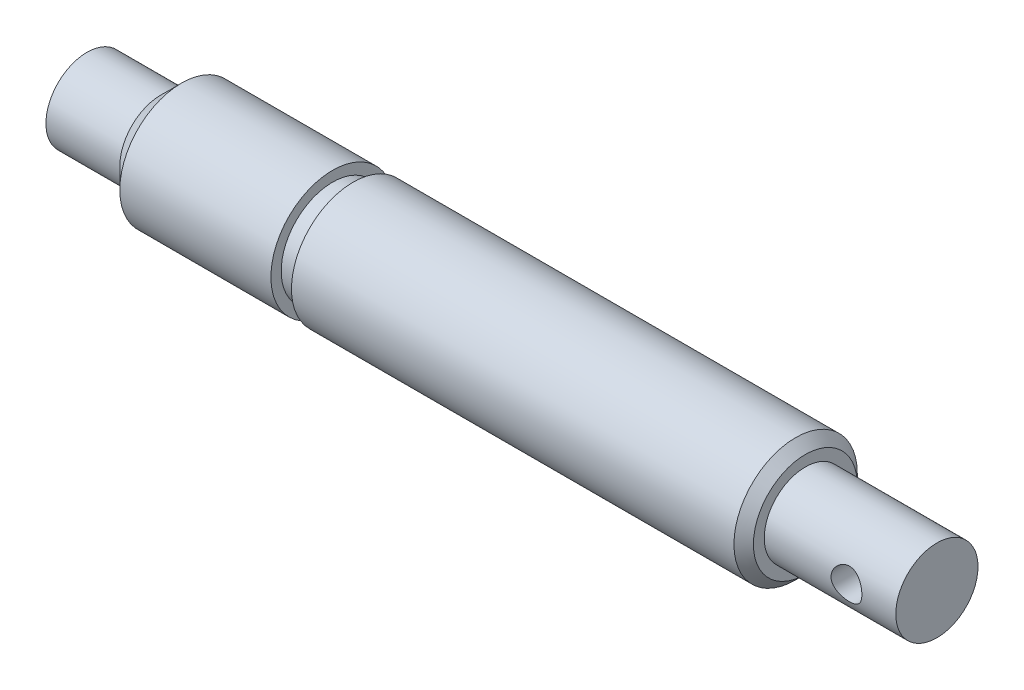
ISO-10303-21;
HEADER;
FILE_DESCRIPTION(('STEP AP214'),'2;1');
FILE_NAME('part.step','',(''),(''),'','','');
FILE_SCHEMA(('AUTOMOTIVE_DESIGN { 1 0 10303 214 1 1 1 1 }'));
ENDSEC;
DATA;
#1=APPLICATION_CONTEXT('core data for automotive mechanical design processes');
#2=APPLICATION_PROTOCOL_DEFINITION('international standard','automotive_design',2000,#1);
#3=PRODUCT_CONTEXT('',#1,'mechanical');
#4=PRODUCT('Part','Part','',(#3));
#5=PRODUCT_RELATED_PRODUCT_CATEGORY('part','',(#4));
#6=PRODUCT_DEFINITION_FORMATION('','',#4);
#7=PRODUCT_DEFINITION_CONTEXT('part definition',#1,'design');
#8=PRODUCT_DEFINITION('design','',#6,#7);
#9=PRODUCT_DEFINITION_SHAPE('','',#8);
#10=(LENGTH_UNIT() NAMED_UNIT(*) SI_UNIT(.MILLI.,.METRE.));
#11=(NAMED_UNIT(*) PLANE_ANGLE_UNIT() SI_UNIT($,.RADIAN.));
#12=(NAMED_UNIT(*) SI_UNIT($,.STERADIAN.) SOLID_ANGLE_UNIT());
#13=UNCERTAINTY_MEASURE_WITH_UNIT(LENGTH_MEASURE(1.E-05),#10,'distance_accuracy_value','');
#14=(GEOMETRIC_REPRESENTATION_CONTEXT(3) GLOBAL_UNCERTAINTY_ASSIGNED_CONTEXT((#13)) GLOBAL_UNIT_ASSIGNED_CONTEXT((#10,
#11,#12)) REPRESENTATION_CONTEXT('',''));
#15=CARTESIAN_POINT('',(0.,0.,0.));
#16=DIRECTION('',(0.,0.,1.));
#17=DIRECTION('',(1.,0.,0.));
#18=AXIS2_PLACEMENT_3D('',#15,#16,#17);
#19=CARTESIAN_POINT('',(2.30940107675852,0.,0.));
#20=DIRECTION('',(1.,0.,0.));
#21=DIRECTION('',(0.,0.,-1.));
#22=AXIS2_PLACEMENT_3D('',#19,#20,#21);
#23=CONICAL_SURFACE('',#22,3.99999999999999,1.04719755119659);
#24=CARTESIAN_POINT('',(0.,0.,0.));
#25=VERTEX_POINT('',#24);
#26=VERTEX_LOOP('',#25);
#27=FACE_BOUND('',#26,.T.);
#28=CARTESIAN_POINT('',(2.30940107675852,0.,0.));
#29=DIRECTION('',(1.,0.,0.));
#30=DIRECTION('',(0.,0.,-1.));
#31=AXIS2_PLACEMENT_3D('',#28,#29,#30);
#32=CIRCLE('',#31,3.99999999999999);
#33=CARTESIAN_POINT('',(2.30940107675852,0.,-3.99999999999999));
#34=VERTEX_POINT('',#33);
#35=EDGE_CURVE('E53',#34,#34,#32,.T.);
#36=ORIENTED_EDGE('',*,*,#35,.F.);
#37=EDGE_LOOP('',(#36));
#38=FACE_BOUND('',#37,.T.);
#39=ADVANCED_FACE('F45',(#27,#38),#23,.T.);
#40=CARTESIAN_POINT('',(85.,0.,0.));
#41=DIRECTION('',(1.,0.,0.));
#42=DIRECTION('',(0.,0.,-1.));
#43=AXIS2_PLACEMENT_3D('',#40,#41,#42);
#44=CYLINDRICAL_SURFACE('',#43,3.99999999999999);
#45=ORIENTED_EDGE('',*,*,#35,.T.);
#46=EDGE_LOOP('',(#45));
#47=FACE_BOUND('',#46,.T.);
#48=CARTESIAN_POINT('',(9.49999999999999,0.,0.));
#49=DIRECTION('',(1.,0.,0.));
#50=DIRECTION('',(0.,0.,-1.));
#51=AXIS2_PLACEMENT_3D('',#48,#49,#50);
#52=CIRCLE('',#51,3.99999999999999);
#53=CARTESIAN_POINT('',(9.49999999999999,0.,-3.99999999999999));
#54=VERTEX_POINT('',#53);
#55=EDGE_CURVE('E62',#54,#54,#52,.T.);
#56=ORIENTED_EDGE('',*,*,#55,.F.);
#57=EDGE_LOOP('',(#56));
#58=FACE_BOUND('',#57,.T.);
#59=ADVANCED_FACE('F58',(#47,#58),#44,.T.);
#60=CARTESIAN_POINT('',(85.,0.,0.));
#61=DIRECTION('',(1.,0.,0.));
#62=DIRECTION('',(0.,0.,-1.));
#63=AXIS2_PLACEMENT_3D('',#60,#61,#62);
#64=CYLINDRICAL_SURFACE('',#63,5.99999999999999);
#65=CARTESIAN_POINT('',(11.5,0.,0.));
#66=DIRECTION('',(-1.,0.,0.));
#67=DIRECTION('',(0.,0.,1.));
#68=AXIS2_PLACEMENT_3D('',#65,#66,#67);
#69=CIRCLE('',#68,5.99999999999999);
#70=CARTESIAN_POINT('',(11.5,0.,5.99999999999999));
#71=VERTEX_POINT('',#70);
#72=EDGE_CURVE('E11',#71,#71,#69,.F.);
#73=ORIENTED_EDGE('',*,*,#72,.T.);
#74=EDGE_LOOP('',(#73));
#75=FACE_BOUND('',#74,.T.);
#76=CARTESIAN_POINT('',(26.2,0.,0.));
#77=DIRECTION('',(1.,0.,0.));
#78=DIRECTION('',(0.,0.,-1.));
#79=AXIS2_PLACEMENT_3D('',#76,#77,#78);
#80=CIRCLE('',#79,5.99999999999999);
#81=CARTESIAN_POINT('',(26.2,0.,-5.99999999999999));
#82=VERTEX_POINT('',#81);
#83=EDGE_CURVE('E65',#82,#82,#80,.T.);
#84=ORIENTED_EDGE('',*,*,#83,.F.);
#85=EDGE_LOOP('',(#84));
#86=FACE_BOUND('',#85,.T.);
#87=ADVANCED_FACE('F132',(#75,#86),#64,.T.);
#88=CARTESIAN_POINT('',(26.2,5.99999999999999,0.));
#89=DIRECTION('',(1.,0.,0.));
#90=DIRECTION('',(0.,0.,-1.));
#91=AXIS2_PLACEMENT_3D('',#88,#89,#90);
#92=PLANE('',#91);
#93=ORIENTED_EDGE('',*,*,#83,.T.);
#94=EDGE_LOOP('',(#93));
#95=FACE_BOUND('',#94,.T.);
#96=CARTESIAN_POINT('',(26.2,0.,0.));
#97=DIRECTION('',(1.,0.,0.));
#98=DIRECTION('',(0.,0.,-1.));
#99=AXIS2_PLACEMENT_3D('',#96,#97,#98);
#100=CIRCLE('',#99,4.99999999999999);
#101=CARTESIAN_POINT('',(26.2,0.,-4.99999999999999));
#102=VERTEX_POINT('',#101);
#103=EDGE_CURVE('E124',#102,#102,#100,.T.);
#104=ORIENTED_EDGE('',*,*,#103,.F.);
#105=EDGE_LOOP('',(#104));
#106=FACE_BOUND('',#105,.T.);
#107=ADVANCED_FACE('F129',(#95,#106),#92,.T.);
#108=CARTESIAN_POINT('',(85.,0.,0.));
#109=DIRECTION('',(1.,0.,0.));
#110=DIRECTION('',(0.,0.,-1.));
#111=AXIS2_PLACEMENT_3D('',#108,#109,#110);
#112=CYLINDRICAL_SURFACE('',#111,4.99999999999999);
#113=ORIENTED_EDGE('',*,*,#103,.T.);
#114=EDGE_LOOP('',(#113));
#115=FACE_BOUND('',#114,.T.);
#116=CARTESIAN_POINT('',(28.2,0.,0.));
#117=DIRECTION('',(1.,0.,0.));
#118=DIRECTION('',(0.,0.,-1.));
#119=AXIS2_PLACEMENT_3D('',#116,#117,#118);
#120=CIRCLE('',#119,4.99999999999999);
#121=CARTESIAN_POINT('',(28.2,0.,-4.99999999999999));
#122=VERTEX_POINT('',#121);
#123=EDGE_CURVE('E121',#122,#122,#120,.T.);
#124=ORIENTED_EDGE('',*,*,#123,.F.);
#125=EDGE_LOOP('',(#124));
#126=FACE_BOUND('',#125,.T.);
#127=ADVANCED_FACE('F140',(#115,#126),#112,.T.);
#128=CARTESIAN_POINT('',(28.2,4.99999999999999,0.));
#129=DIRECTION('',(-1.,0.,0.));
#130=DIRECTION('',(0.,0.,1.));
#131=AXIS2_PLACEMENT_3D('',#128,#129,#130);
#132=PLANE('',#131);
#133=ORIENTED_EDGE('',*,*,#123,.T.);
#134=EDGE_LOOP('',(#133));
#135=FACE_BOUND('',#134,.T.);
#136=CARTESIAN_POINT('',(28.2,0.,0.));
#137=DIRECTION('',(1.,0.,0.));
#138=DIRECTION('',(0.,0.,-1.));
#139=AXIS2_PLACEMENT_3D('',#136,#137,#138);
#140=CIRCLE('',#139,5.99999999999999);
#141=CARTESIAN_POINT('',(28.2,0.,-5.99999999999999));
#142=VERTEX_POINT('',#141);
#143=EDGE_CURVE('E112',#142,#142,#140,.T.);
#144=ORIENTED_EDGE('',*,*,#143,.F.);
#145=EDGE_LOOP('',(#144));
#146=FACE_BOUND('',#145,.T.);
#147=ADVANCED_FACE('F147',(#135,#146),#132,.T.);
#148=CARTESIAN_POINT('',(85.,0.,0.));
#149=DIRECTION('',(1.,0.,0.));
#150=DIRECTION('',(0.,0.,-1.));
#151=AXIS2_PLACEMENT_3D('',#148,#149,#150);
#152=CYLINDRICAL_SURFACE('',#151,5.99999999999999);
#153=CARTESIAN_POINT('',(71.253,0.,0.));
#154=DIRECTION('',(-1.,0.,0.));
#155=DIRECTION('',(0.,0.,1.));
#156=AXIS2_PLACEMENT_3D('',#153,#154,#155);
#157=CIRCLE('',#156,6.);
#158=CARTESIAN_POINT('',(71.253,0.,6.));
#159=VERTEX_POINT('',#158);
#160=EDGE_CURVE('E109',#159,#159,#157,.T.);
#161=ORIENTED_EDGE('',*,*,#160,.T.);
#162=EDGE_LOOP('',(#161));
#163=FACE_BOUND('',#162,.T.);
#164=ORIENTED_EDGE('',*,*,#143,.T.);
#165=EDGE_LOOP('',(#164));
#166=FACE_BOUND('',#165,.T.);
#167=ADVANCED_FACE('F94',(#163,#166),#152,.T.);
#168=CARTESIAN_POINT('',(72.2,0.,0.));
#169=DIRECTION('',(-1.,0.,0.));
#170=DIRECTION('',(0.,0.,1.));
#171=AXIS2_PLACEMENT_3D('',#168,#169,#170);
#172=CONICAL_SURFACE('',#171,5.053,0.785398163397453);
#173=ORIENTED_EDGE('',*,*,#160,.F.);
#174=EDGE_LOOP('',(#173));
#175=FACE_BOUND('',#174,.T.);
#176=CARTESIAN_POINT('',(72.2,0.,0.));
#177=DIRECTION('',(-1.,0.,0.));
#178=DIRECTION('',(0.,0.,1.));
#179=AXIS2_PLACEMENT_3D('',#176,#177,#178);
#180=CIRCLE('',#179,5.053);
#181=CARTESIAN_POINT('',(72.2,0.,5.053));
#182=VERTEX_POINT('',#181);
#183=EDGE_CURVE('E115',#182,#182,#180,.T.);
#184=ORIENTED_EDGE('',*,*,#183,.T.);
#185=EDGE_LOOP('',(#184));
#186=FACE_BOUND('',#185,.T.);
#187=ADVANCED_FACE('F90',(#175,#186),#172,.T.);
#188=CARTESIAN_POINT('',(85.,3.99999999999999,0.));
#189=DIRECTION('',(1.,0.,0.));
#190=DIRECTION('',(0.,0.,-1.));
#191=AXIS2_PLACEMENT_3D('',#188,#189,#190);
#192=PLANE('',#191);
#193=CARTESIAN_POINT('',(85.,0.,0.));
#194=DIRECTION('',(1.,0.,0.));
#195=DIRECTION('',(0.,0.,-1.));
#196=AXIS2_PLACEMENT_3D('',#193,#194,#195);
#197=CIRCLE('',#196,3.99999999999999);
#198=CARTESIAN_POINT('',(85.,0.,-3.99999999999999));
#199=VERTEX_POINT('',#198);
#200=EDGE_CURVE('E106',#199,#199,#197,.T.);
#201=ORIENTED_EDGE('',*,*,#200,.T.);
#202=EDGE_LOOP('',(#201));
#203=FACE_BOUND('',#202,.T.);
#204=ADVANCED_FACE('F93',(#203),#192,.T.);
#205=CARTESIAN_POINT('',(85.,0.,0.));
#206=DIRECTION('',(1.,0.,0.));
#207=DIRECTION('',(0.,0.,-1.));
#208=AXIS2_PLACEMENT_3D('',#205,#206,#207);
#209=CYLINDRICAL_SURFACE('',#208,4.);
#210=CARTESIAN_POINT('',(78.7,0.,-4.));
#211=CARTESIAN_POINT('',(78.6999970976969,0.0812350589378529,-4.00000217456151));
#212=CARTESIAN_POINT('',(78.7066197602484,0.162450241781793,-3.99750379283184));
#213=CARTESIAN_POINT('',(78.7328281952699,0.322453452352361,-3.98778696006927));
#214=CARTESIAN_POINT('',(78.7524121004706,0.401241827987615,-3.98056918893993));
#215=CARTESIAN_POINT('',(78.8037530017718,0.554060784990882,-3.96218832391544));
#216=CARTESIAN_POINT('',(78.8354865168218,0.628100224162285,-3.9510328434944));
#217=CARTESIAN_POINT('',(78.9101064130158,0.769799310160262,-3.92588767765353));
#218=CARTESIAN_POINT('',(78.9529957855442,0.837457239177883,-3.91189723227547));
#219=CARTESIAN_POINT('',(79.0506125310709,0.967346417045828,-3.88186246971216));
#220=CARTESIAN_POINT('',(79.1057302622594,1.0292707301512,-3.86576002583565));
#221=CARTESIAN_POINT('',(79.2254104346588,1.14324421474364,-3.83360220871326));
#222=CARTESIAN_POINT('',(79.2899757560879,1.19529036359203,-3.81754685135032));
#223=CARTESIAN_POINT('',(79.4297174675232,1.28998202215985,-3.78662470617731));
#224=CARTESIAN_POINT('',(79.5052043665458,1.3321939319576,-3.77182648820818));
#225=CARTESIAN_POINT('',(79.6628483541685,1.40318646334085,-3.74599860237433));
#226=CARTESIAN_POINT('',(79.7450027631551,1.43197244961239,-3.73496742975881));
#227=CARTESIAN_POINT('',(79.9101167402582,1.47408431017549,-3.71854412824136));
#228=CARTESIAN_POINT('',(79.9929050384354,1.48799593218557,-3.71293924350837));
#229=CARTESIAN_POINT('',(80.1598161579938,1.50179556531648,-3.70738061461214));
#230=CARTESIAN_POINT('',(80.2439384138745,1.5016893680263,-3.70742453659304));
#231=CARTESIAN_POINT('',(80.405769525213,1.48790429610018,-3.71297511632054));
#232=CARTESIAN_POINT('',(80.4835609060442,1.47503808509003,-3.71815468871121));
#233=CARTESIAN_POINT('',(80.6357871504053,1.43744167868329,-3.73284938059529));
#234=CARTESIAN_POINT('',(80.7102215066139,1.41270969663258,-3.74236515298863));
#235=CARTESIAN_POINT('',(80.8552770677282,1.35163748571903,-3.76485702190253));
#236=CARTESIAN_POINT('',(80.9257994861213,1.31508648737099,-3.77789517988166));
#237=CARTESIAN_POINT('',(81.059945737591,1.23156073762697,-3.80594210139319));
#238=CARTESIAN_POINT('',(81.1235671775197,1.18458238728896,-3.82095154457157));
#239=CARTESIAN_POINT('',(81.2466036636509,1.07781780766548,-3.85248038859113));
#240=CARTESIAN_POINT('',(81.3054486407481,1.01738298716955,-3.8690334745567));
#241=CARTESIAN_POINT('',(81.4123379662058,0.88731259081901,-3.90091728164085));
#242=CARTESIAN_POINT('',(81.4603806546057,0.817675603497354,-3.91624781465952));
#243=CARTESIAN_POINT('',(81.5449303970625,0.66972343699241,-3.9442639480908));
#244=CARTESIAN_POINT('',(81.581247581221,0.591290713844708,-3.95690498259616));
#245=CARTESIAN_POINT('',(81.63998260427,0.428836850524573,-3.97778718326962));
#246=CARTESIAN_POINT('',(81.6624066165611,0.34481821084576,-3.98603030341493));
#247=CARTESIAN_POINT('',(81.6916227875419,0.178375243148661,-3.99684443228065));
#248=CARTESIAN_POINT('',(81.6991826063825,0.0961036195622048,-3.99969369025686));
#249=CARTESIAN_POINT('',(81.7006910638999,-0.0685724752550285,-4.00025893700125));
#250=CARTESIAN_POINT('',(81.6946427203168,-0.150976912983377,-3.99797606386863));
#251=CARTESIAN_POINT('',(81.6696899576913,-0.310262048561863,-3.98871709772643));
#252=CARTESIAN_POINT('',(81.6512884562629,-0.38723332800734,-3.98192470962304));
#253=CARTESIAN_POINT('',(81.6028139274527,-0.536941754957225,-3.96451477091717));
#254=CARTESIAN_POINT('',(81.5727393820519,-0.609678350347538,-3.9538967228203));
#255=CARTESIAN_POINT('',(81.5008135875605,-0.751247765110156,-3.92949624407681));
#256=CARTESIAN_POINT('',(81.4586422707766,-0.819903083557793,-3.91563000209348));
#257=CARTESIAN_POINT('',(81.3640818968284,-0.949392711726622,-3.88626671564663));
#258=CARTESIAN_POINT('',(81.3116890674548,-1.01022412027045,-3.87076907009516));
#259=CARTESIAN_POINT('',(81.1945958778757,-1.12603079874454,-3.83873329490989));
#260=CARTESIAN_POINT('',(81.1293578172273,-1.18046154123568,-3.82218696503729));
#261=CARTESIAN_POINT('',(80.9903486152923,-1.27771050031903,-3.79078815746853));
#262=CARTESIAN_POINT('',(80.9165767086115,-1.32052767414518,-3.77593583194399));
#263=CARTESIAN_POINT('',(80.7619840132277,-1.39337773518998,-3.74966829822463));
#264=CARTESIAN_POINT('',(80.6811352540895,-1.42335685446918,-3.73826760328493));
#265=CARTESIAN_POINT('',(80.5149902363122,-1.46907883466889,-3.72054032891005));
#266=CARTESIAN_POINT('',(80.4296967638019,-1.48483050305535,-3.7142106105749));
#267=CARTESIAN_POINT('',(80.2629838404589,-1.50086347097839,-3.70775894792573));
#268=CARTESIAN_POINT('',(80.1816673682831,-1.50207331495837,-3.70726444523341));
#269=CARTESIAN_POINT('',(80.0200546837238,-1.49136715641592,-3.71158412745292));
#270=CARTESIAN_POINT('',(79.9397583753284,-1.47945239850123,-3.71639780898899));
#271=CARTESIAN_POINT('',(79.7849527732834,-1.44355815630241,-3.73048141585432));
#272=CARTESIAN_POINT('',(79.7103416537546,-1.41995798316523,-3.73961085376663));
#273=CARTESIAN_POINT('',(79.5660944915056,-1.36169696779918,-3.76121548297845));
#274=CARTESIAN_POINT('',(79.4964597119298,-1.32703332944944,-3.77369151995214));
#275=CARTESIAN_POINT('',(79.3601732103023,-1.24552075938153,-3.80139723903964));
#276=CARTESIAN_POINT('',(79.2938692032001,-1.1981283280301,-3.81673698440964));
#277=CARTESIAN_POINT('',(79.1698584390288,-1.09334485729905,-3.84806246757177));
#278=CARTESIAN_POINT('',(79.1121544252132,-1.03595064012808,-3.86404840943145));
#279=CARTESIAN_POINT('',(79.0037980441782,-0.909080396784617,-3.89590424609881));
#280=CARTESIAN_POINT('',(78.9536962465653,-0.839118644212985,-3.91172104900644));
#281=CARTESIAN_POINT('',(78.8659773447234,-0.691213223200814,-3.9405451445703));
#282=CARTESIAN_POINT('',(78.8283612122636,-0.613268934090616,-3.95355221851559));
#283=CARTESIAN_POINT('',(78.7656231709517,-0.447999082002307,-3.9757429260668));
#284=CARTESIAN_POINT('',(78.7411129353981,-0.360413422234204,-3.98473657158356));
#285=CARTESIAN_POINT('',(78.7083070400793,-0.181875733606379,-3.99686242179586));
#286=CARTESIAN_POINT('',(78.7000032485127,-0.0909254163648579,-3.99999756603967));
#287=CARTESIAN_POINT('',(78.7,0.,-4.));
#288=B_SPLINE_CURVE_WITH_KNOTS('',3,(#210,#211,#212,#213,#214,#215,#216,#217,#218,#219,#220,
#221,#222,#223,#224,#225,#226,#227,#228,#229,#230,#231,#232,#233,#234,#235,#236,#237,#238,#239,
#240,#241,#242,#243,#244,#245,#246,#247,#248,#249,#250,#251,#252,#253,#254,#255,#256,#257,#258,
#259,#260,#261,#262,#263,#264,#265,#266,#267,#268,#269,#270,#271,#272,#273,#274,#275,#276,#277,
#278,#279,#280,#281,#282,#283,#284,#285,#286,#287),.UNSPECIFIED.,.T.,.F.,(4,2,2,2,2,2,2,2,2,2,2,
2,2,2,2,2,2,2,2,2,2,2,2,2,2,2,2,2,2,2,2,2,2,2,2,2,2,2,4),(0.,0.24336980156056,0.486704549530463,
0.72957136921358,0.972503379609495,1.22473618582716,1.47704604925622,1.7389667450166,
2.00078269352135,2.251858744169,2.50283106079707,2.73878345119972,2.9747713806059,
3.21522408387019,3.45575990744259,3.71246153335813,3.96920257905066,4.22991375286076,
4.49050899698846,4.73725019635925,4.9839366839052,5.2211443792384,5.45838293254453,
5.70259221859599,5.94689180019866,6.20536519455657,6.4638617892014,6.72343066727204,
6.98283874956506,7.22558763480252,7.46831350211259,7.70363142426535,7.93900886656506,
8.1867247188427,8.43451941997061,8.69572329654038,8.95694749805101,9.22948515032041,
9.50188601796126),.UNSPECIFIED.);
#289=CARTESIAN_POINT('',(78.7,0.,-4.));
#290=VERTEX_POINT('',#289);
#291=EDGE_CURVE('E76',#290,#290,#288,.T.);
#292=ORIENTED_EDGE('',*,*,#291,.F.);
#293=EDGE_LOOP('',(#292));
#294=FACE_BOUND('',#293,.T.);
#295=CARTESIAN_POINT('',(81.7,0.,4.));
#296=CARTESIAN_POINT('',(81.7000029023031,0.0812350589378528,4.00000217456151));
#297=CARTESIAN_POINT('',(81.6933802397516,0.162450241781793,3.99750379283184));
#298=CARTESIAN_POINT('',(81.6671718047301,0.322453452352361,3.98778696006927));
#299=CARTESIAN_POINT('',(81.6475878995294,0.401241827987615,3.98056918893993));
#300=CARTESIAN_POINT('',(81.5962469982282,0.554060784990882,3.96218832391544));
#301=CARTESIAN_POINT('',(81.5645134831782,0.628100224162285,3.9510328434944));
#302=CARTESIAN_POINT('',(81.4898935869842,0.769799310160262,3.92588767765353));
#303=CARTESIAN_POINT('',(81.4470042144558,0.837457239177883,3.91189723227547));
#304=CARTESIAN_POINT('',(81.3493874689291,0.967346417045828,3.88186246971216));
#305=CARTESIAN_POINT('',(81.2942697377406,1.0292707301512,3.86576002583565));
#306=CARTESIAN_POINT('',(81.1745895653411,1.14324421474364,3.83360220871326));
#307=CARTESIAN_POINT('',(81.1100242439121,1.19529036359203,3.81754685135032));
#308=CARTESIAN_POINT('',(80.9702825324768,1.28998202215985,3.78662470617731));
#309=CARTESIAN_POINT('',(80.8947956334542,1.3321939319576,3.77182648820818));
#310=CARTESIAN_POINT('',(80.7371516458315,1.40318646334084,3.74599860237433));
#311=CARTESIAN_POINT('',(80.6549972368449,1.43197244961239,3.73496742975881));
#312=CARTESIAN_POINT('',(80.4898832597418,1.47408431017549,3.71854412824136));
#313=CARTESIAN_POINT('',(80.4070949615646,1.48799593218557,3.71293924350837));
#314=CARTESIAN_POINT('',(80.2401838420061,1.50179556531648,3.70738061461214));
#315=CARTESIAN_POINT('',(80.1560615861255,1.5016893680263,3.70742453659304));
#316=CARTESIAN_POINT('',(79.994230474787,1.48790429610018,3.71297511632054));
#317=CARTESIAN_POINT('',(79.9164390939558,1.47503808509003,3.71815468871121));
#318=CARTESIAN_POINT('',(79.7642128495947,1.43744167868329,3.73284938059529));
#319=CARTESIAN_POINT('',(79.6897784933861,1.41270969663258,3.74236515298863));
#320=CARTESIAN_POINT('',(79.5447229322717,1.35163748571903,3.76485702190253));
#321=CARTESIAN_POINT('',(79.4742005138787,1.31508648737099,3.77789517988166));
#322=CARTESIAN_POINT('',(79.340054262409,1.23156073762697,3.80594210139319));
#323=CARTESIAN_POINT('',(79.2764328224803,1.18458238728896,3.82095154457157));
#324=CARTESIAN_POINT('',(79.1533963363491,1.07781780766548,3.85248038859113));
#325=CARTESIAN_POINT('',(79.0945513592519,1.01738298716955,3.8690334745567));
#326=CARTESIAN_POINT('',(78.9876620337942,0.88731259081901,3.90091728164085));
#327=CARTESIAN_POINT('',(78.9396193453943,0.817675603497354,3.91624781465952));
#328=CARTESIAN_POINT('',(78.8550696029375,0.669723436992411,3.9442639480908));
#329=CARTESIAN_POINT('',(78.8187524187789,0.591290713844711,3.95690498259616));
#330=CARTESIAN_POINT('',(78.7600173957299,0.428836850524576,3.97778718326962));
#331=CARTESIAN_POINT('',(78.7375933834389,0.344818210845761,3.98603030341493));
#332=CARTESIAN_POINT('',(78.708377212458,0.178375243148661,3.99684443228065));
#333=CARTESIAN_POINT('',(78.7008173936175,0.0961036195622048,3.99969369025686));
#334=CARTESIAN_POINT('',(78.6993089361001,-0.0685724752550285,4.00025893700125));
#335=CARTESIAN_POINT('',(78.7053572796832,-0.150976912983377,3.99797606386863));
#336=CARTESIAN_POINT('',(78.7303100423087,-0.310262048561863,3.98871709772643));
#337=CARTESIAN_POINT('',(78.7487115437371,-0.38723332800734,3.98192470962304));
#338=CARTESIAN_POINT('',(78.7971860725473,-0.536941754957225,3.96451477091717));
#339=CARTESIAN_POINT('',(78.827260617948,-0.609678350347538,3.9538967228203));
#340=CARTESIAN_POINT('',(78.8991864124395,-0.751247765110156,3.92949624407681));
#341=CARTESIAN_POINT('',(78.9413577292234,-0.819903083557793,3.91563000209348));
#342=CARTESIAN_POINT('',(79.0359181031716,-0.949392711726622,3.88626671564663));
#343=CARTESIAN_POINT('',(79.0883109325451,-1.01022412027045,3.87076907009516));
#344=CARTESIAN_POINT('',(79.2054041221243,-1.12603079874454,3.83873329490989));
#345=CARTESIAN_POINT('',(79.2706421827727,-1.18046154123568,3.82218696503729));
#346=CARTESIAN_POINT('',(79.4096513847077,-1.27771050031903,3.79078815746853));
#347=CARTESIAN_POINT('',(79.4834232913885,-1.32052767414518,3.77593583194399));
#348=CARTESIAN_POINT('',(79.6380159867723,-1.39337773518998,3.74966829822463));
#349=CARTESIAN_POINT('',(79.7188647459105,-1.42335685446918,3.73826760328493));
#350=CARTESIAN_POINT('',(79.8850097636878,-1.46907883466889,3.72054032891005));
#351=CARTESIAN_POINT('',(79.9703032361981,-1.48483050305535,3.7142106105749));
#352=CARTESIAN_POINT('',(80.1370161595411,-1.50086347097839,3.70775894792573));
#353=CARTESIAN_POINT('',(80.2183326317169,-1.50207331495837,3.70726444523341));
#354=CARTESIAN_POINT('',(80.3799453162762,-1.49136715641592,3.71158412745292));
#355=CARTESIAN_POINT('',(80.4602416246716,-1.47945239850123,3.71639780898899));
#356=CARTESIAN_POINT('',(80.6150472267166,-1.44355815630241,3.73048141585432));
#357=CARTESIAN_POINT('',(80.6896583462453,-1.41995798316523,3.73961085376663));
#358=CARTESIAN_POINT('',(80.8339055084944,-1.36169696779919,3.76121548297844));
#359=CARTESIAN_POINT('',(80.9035402880701,-1.32703332944944,3.77369151995214));
#360=CARTESIAN_POINT('',(81.0398267896976,-1.24552075938153,3.80139723903964));
#361=CARTESIAN_POINT('',(81.1061307967999,-1.1981283280301,3.81673698440964));
#362=CARTESIAN_POINT('',(81.2301415609712,-1.09334485729905,3.84806246757177));
#363=CARTESIAN_POINT('',(81.2878455747867,-1.03595064012808,3.86404840943145));
#364=CARTESIAN_POINT('',(81.3962019558218,-0.909080396784617,3.89590424609881));
#365=CARTESIAN_POINT('',(81.4463037534347,-0.839118644212985,3.91172104900644));
#366=CARTESIAN_POINT('',(81.5340226552766,-0.691213223200814,3.9405451445703));
#367=CARTESIAN_POINT('',(81.5716387877364,-0.613268934090616,3.95355221851559));
#368=CARTESIAN_POINT('',(81.6343768290483,-0.447999082002306,3.9757429260668));
#369=CARTESIAN_POINT('',(81.6588870646019,-0.360413422234202,3.98473657158356));
#370=CARTESIAN_POINT('',(81.6916929599207,-0.181875733606377,3.99686242179586));
#371=CARTESIAN_POINT('',(81.6999967514873,-0.0909254163648571,3.99999756603967));
#372=CARTESIAN_POINT('',(81.7,0.,4.));
#373=B_SPLINE_CURVE_WITH_KNOTS('',3,(#295,#296,#297,#298,#299,#300,#301,#302,#303,#304,#305,
#306,#307,#308,#309,#310,#311,#312,#313,#314,#315,#316,#317,#318,#319,#320,#321,#322,#323,#324,
#325,#326,#327,#328,#329,#330,#331,#332,#333,#334,#335,#336,#337,#338,#339,#340,#341,#342,#343,
#344,#345,#346,#347,#348,#349,#350,#351,#352,#353,#354,#355,#356,#357,#358,#359,#360,#361,#362,
#363,#364,#365,#366,#367,#368,#369,#370,#371,#372),.UNSPECIFIED.,.T.,.F.,(4,2,2,2,2,2,2,2,2,2,2,
2,2,2,2,2,2,2,2,2,2,2,2,2,2,2,2,2,2,2,2,2,2,2,2,2,2,2,4),(0.,0.24336980156056,0.486704549530463,
0.72957136921358,0.972503379609495,1.22473618582716,1.47704604925622,1.73896674501659,
2.00078269352134,2.251858744169,2.50283106079707,2.73878345119973,2.9747713806059,
3.21522408387019,3.45575990744259,3.71246153335813,3.96920257905066,4.22991375286075,
4.49050899698846,4.73725019635925,4.9839366839052,5.2211443792384,5.45838293254453,
5.70259221859599,5.94689180019866,6.20536519455657,6.4638617892014,6.72343066727204,
6.98283874956506,7.22558763480252,7.46831350211259,7.70363142426532,7.93900886656506,
8.1867247188427,8.43451941997061,8.69572329654038,8.95694749805101,9.22948515032041,
9.50188601796126),.UNSPECIFIED.);
#374=CARTESIAN_POINT('',(81.7,0.,4.));
#375=VERTEX_POINT('',#374);
#376=EDGE_CURVE('E69',#375,#375,#373,.T.);
#377=ORIENTED_EDGE('',*,*,#376,.F.);
#378=EDGE_LOOP('',(#377));
#379=FACE_BOUND('',#378,.T.);
#380=CARTESIAN_POINT('',(72.2,0.,0.));
#381=DIRECTION('',(1.,0.,0.));
#382=DIRECTION('',(0.,0.,-1.));
#383=AXIS2_PLACEMENT_3D('',#380,#381,#382);
#384=CIRCLE('',#383,4.);
#385=CARTESIAN_POINT('',(72.2,0.,-4.));
#386=VERTEX_POINT('',#385);
#387=EDGE_CURVE('E108',#386,#386,#384,.T.);
#388=ORIENTED_EDGE('',*,*,#387,.T.);
#389=EDGE_LOOP('',(#388));
#390=FACE_BOUND('',#389,.T.);
#391=ORIENTED_EDGE('',*,*,#200,.F.);
#392=EDGE_LOOP('',(#391));
#393=FACE_BOUND('',#392,.T.);
#394=ADVANCED_FACE('F80',(#294,#379,#390,#393),#209,.T.);
#395=CARTESIAN_POINT('',(72.2,5.99999999999999,0.));
#396=DIRECTION('',(1.,0.,0.));
#397=DIRECTION('',(0.,0.,-1.));
#398=AXIS2_PLACEMENT_3D('',#395,#396,#397);
#399=PLANE('',#398);
#400=ORIENTED_EDGE('',*,*,#387,.F.);
#401=EDGE_LOOP('',(#400));
#402=FACE_BOUND('',#401,.T.);
#403=ORIENTED_EDGE('',*,*,#183,.F.);
#404=EDGE_LOOP('',(#403));
#405=FACE_BOUND('',#404,.T.);
#406=ADVANCED_FACE('F88',(#402,#405),#399,.T.);
#407=CARTESIAN_POINT('',(80.2,0.,-6.));
#408=DIRECTION('',(0.,0.,1.));
#409=DIRECTION('',(1.,0.,0.));
#410=AXIS2_PLACEMENT_3D('',#407,#408,#409);
#411=CYLINDRICAL_SURFACE('',#410,1.5);
#412=ORIENTED_EDGE('',*,*,#291,.T.);
#413=EDGE_LOOP('',(#412));
#414=FACE_BOUND('',#413,.T.);
#415=ORIENTED_EDGE('',*,*,#376,.T.);
#416=EDGE_LOOP('',(#415));
#417=FACE_BOUND('',#416,.T.);
#418=ADVANCED_FACE('F84',(#414,#417),#411,.F.);
#419=CARTESIAN_POINT('',(11.5,0.,0.));
#420=DIRECTION('',(1.,0.,0.));
#421=DIRECTION('',(0.,0.,-1.));
#422=AXIS2_PLACEMENT_3D('',#419,#420,#421);
#423=CONICAL_SURFACE('',#422,5.99999999999999,0.785398163397449);
#424=ORIENTED_EDGE('',*,*,#55,.T.);
#425=EDGE_LOOP('',(#424));
#426=FACE_BOUND('',#425,.T.);
#427=ORIENTED_EDGE('',*,*,#72,.F.);
#428=EDGE_LOOP('',(#427));
#429=FACE_BOUND('',#428,.T.);
#430=ADVANCED_FACE('F48',(#426,#429),#423,.T.);
#431=CLOSED_SHELL('',(#39,#59,#87,#107,#127,#147,#167,#187,#204,#394,#406,#418,#430));
#432=MANIFOLD_SOLID_BREP('B2',#431);
#433=ADVANCED_BREP_SHAPE_REPRESENTATION('',(#18,#432),#14);
#434=SHAPE_DEFINITION_REPRESENTATION(#9,#433);
ENDSEC;
END-ISO-10303-21;
